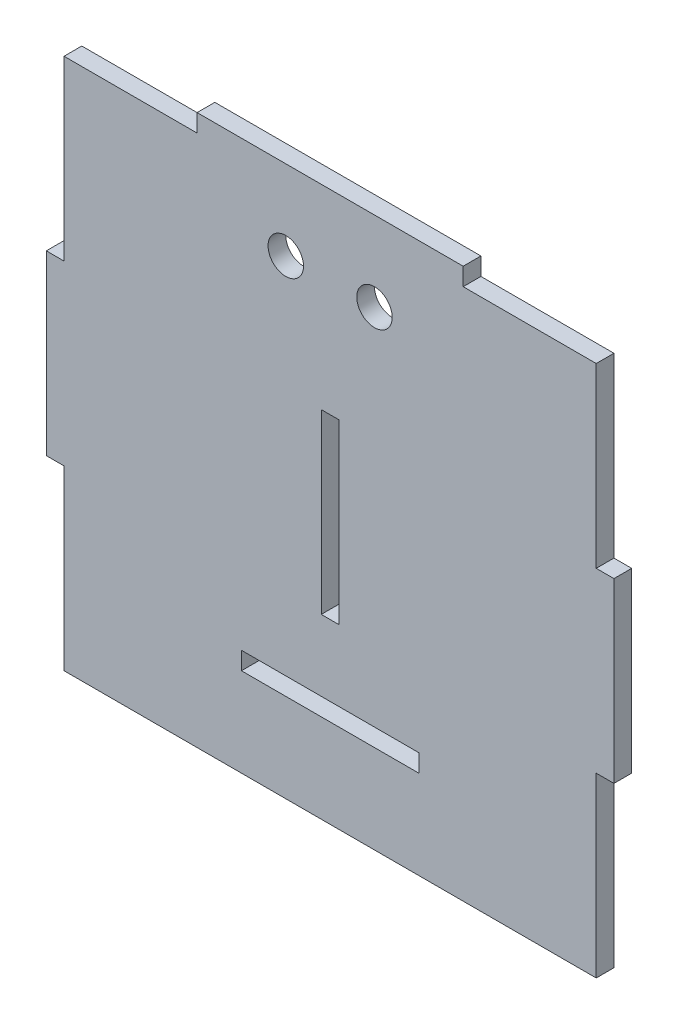
ISO-10303-21;
HEADER;
FILE_DESCRIPTION(('STEP AP214'),'2;1');
FILE_NAME('part.step','',(''),(''),'','','');
FILE_SCHEMA(('AUTOMOTIVE_DESIGN { 1 0 10303 214 1 1 1 1 }'));
ENDSEC;
DATA;
#1=APPLICATION_CONTEXT('core data for automotive mechanical design processes');
#2=APPLICATION_PROTOCOL_DEFINITION('international standard','automotive_design',2000,#1);
#3=PRODUCT_CONTEXT('',#1,'mechanical');
#4=PRODUCT('Part','Part','',(#3));
#5=PRODUCT_RELATED_PRODUCT_CATEGORY('part','',(#4));
#6=PRODUCT_DEFINITION_FORMATION('','',#4);
#7=PRODUCT_DEFINITION_CONTEXT('part definition',#1,'design');
#8=PRODUCT_DEFINITION('design','',#6,#7);
#9=PRODUCT_DEFINITION_SHAPE('','',#8);
#10=(LENGTH_UNIT() NAMED_UNIT(*) SI_UNIT(.MILLI.,.METRE.));
#11=(NAMED_UNIT(*) PLANE_ANGLE_UNIT() SI_UNIT($,.RADIAN.));
#12=(NAMED_UNIT(*) SI_UNIT($,.STERADIAN.) SOLID_ANGLE_UNIT());
#13=UNCERTAINTY_MEASURE_WITH_UNIT(LENGTH_MEASURE(1.E-05),#10,'distance_accuracy_value','');
#14=(GEOMETRIC_REPRESENTATION_CONTEXT(3) GLOBAL_UNCERTAINTY_ASSIGNED_CONTEXT((#13)) GLOBAL_UNIT_ASSIGNED_CONTEXT((#10,
#11,#12)) REPRESENTATION_CONTEXT('',''));
#15=CARTESIAN_POINT('',(0.,0.,0.));
#16=DIRECTION('',(0.,0.,1.));
#17=DIRECTION('',(1.,0.,0.));
#18=AXIS2_PLACEMENT_3D('',#15,#16,#17);
#19=CARTESIAN_POINT('',(0.,40.,2.));
#20=DIRECTION('',(0.,1.,0.));
#21=DIRECTION('',(0.,0.,1.));
#22=AXIS2_PLACEMENT_3D('',#19,#20,#21);
#23=PLANE('',#22);
#24=DIRECTION('',(1.,0.,0.));
#25=VECTOR('',#24,1.);
#26=CARTESIAN_POINT('',(0.,40.,0.));
#27=LINE('',#26,#25);
#28=CARTESIAN_POINT('',(29.,40.,0.));
#29=VERTEX_POINT('',#28);
#30=CARTESIAN_POINT('',(31.,40.,0.));
#31=VERTEX_POINT('',#30);
#32=EDGE_CURVE('E320',#29,#31,#27,.T.);
#33=ORIENTED_EDGE('',*,*,#32,.T.);
#34=DIRECTION('',(0.,0.,-1.));
#35=VECTOR('',#34,1.);
#36=CARTESIAN_POINT('',(31.,40.,2.));
#37=LINE('',#36,#35);
#38=CARTESIAN_POINT('',(31.,40.,2.));
#39=VERTEX_POINT('',#38);
#40=EDGE_CURVE('E11',#39,#31,#37,.T.);
#41=ORIENTED_EDGE('',*,*,#40,.F.);
#42=DIRECTION('',(1.,0.,0.));
#43=VECTOR('',#42,1.);
#44=CARTESIAN_POINT('',(0.,40.,2.));
#45=LINE('',#44,#43);
#46=CARTESIAN_POINT('',(29.,40.,2.));
#47=VERTEX_POINT('',#46);
#48=EDGE_CURVE('E222',#47,#39,#45,.T.);
#49=ORIENTED_EDGE('',*,*,#48,.F.);
#50=DIRECTION('',(0.,0.,-1.));
#51=VECTOR('',#50,1.);
#52=CARTESIAN_POINT('',(29.,40.,2.));
#53=LINE('',#52,#51);
#54=EDGE_CURVE('E65',#47,#29,#53,.T.);
#55=ORIENTED_EDGE('',*,*,#54,.T.);
#56=EDGE_LOOP('',(#33,#41,#49,#55));
#57=FACE_BOUND('',#56,.T.);
#58=ADVANCED_FACE('F45',(#57),#23,.F.);
#59=CARTESIAN_POINT('',(31.,0.,2.));
#60=DIRECTION('',(1.,0.,0.));
#61=DIRECTION('',(0.,0.,-1.));
#62=AXIS2_PLACEMENT_3D('',#59,#60,#61);
#63=PLANE('',#62);
#64=DIRECTION('',(0.,-1.,0.));
#65=VECTOR('',#64,1.);
#66=CARTESIAN_POINT('',(31.,0.,0.));
#67=LINE('',#66,#65);
#68=CARTESIAN_POINT('',(31.,20.,0.));
#69=VERTEX_POINT('',#68);
#70=EDGE_CURVE('E229',#31,#69,#67,.T.);
#71=ORIENTED_EDGE('',*,*,#70,.T.);
#72=DIRECTION('',(0.,0.,-1.));
#73=VECTOR('',#72,1.);
#74=CARTESIAN_POINT('',(31.,20.,2.));
#75=LINE('',#74,#73);
#76=CARTESIAN_POINT('',(31.,20.,2.));
#77=VERTEX_POINT('',#76);
#78=EDGE_CURVE('E56',#77,#69,#75,.T.);
#79=ORIENTED_EDGE('',*,*,#78,.F.);
#80=DIRECTION('',(0.,-1.,0.));
#81=VECTOR('',#80,1.);
#82=CARTESIAN_POINT('',(31.,0.,2.));
#83=LINE('',#82,#81);
#84=EDGE_CURVE('E216',#39,#77,#83,.T.);
#85=ORIENTED_EDGE('',*,*,#84,.F.);
#86=ORIENTED_EDGE('',*,*,#40,.T.);
#87=EDGE_LOOP('',(#71,#79,#85,#86));
#88=FACE_BOUND('',#87,.T.);
#89=ADVANCED_FACE('F228',(#88),#63,.F.);
#90=CARTESIAN_POINT('',(0.,20.,2.));
#91=DIRECTION('',(0.,1.,0.));
#92=DIRECTION('',(0.,0.,1.));
#93=AXIS2_PLACEMENT_3D('',#90,#91,#92);
#94=PLANE('',#93);
#95=DIRECTION('',(1.,0.,0.));
#96=VECTOR('',#95,1.);
#97=CARTESIAN_POINT('',(0.,20.,0.));
#98=LINE('',#97,#96);
#99=CARTESIAN_POINT('',(29.,20.,0.));
#100=VERTEX_POINT('',#99);
#101=EDGE_CURVE('E325',#100,#69,#98,.T.);
#102=ORIENTED_EDGE('',*,*,#101,.F.);
#103=DIRECTION('',(0.,0.,-1.));
#104=VECTOR('',#103,1.);
#105=CARTESIAN_POINT('',(29.,20.,2.));
#106=LINE('',#105,#104);
#107=CARTESIAN_POINT('',(29.,20.,2.));
#108=VERTEX_POINT('',#107);
#109=EDGE_CURVE('E139',#108,#100,#106,.T.);
#110=ORIENTED_EDGE('',*,*,#109,.F.);
#111=DIRECTION('',(1.,0.,0.));
#112=VECTOR('',#111,1.);
#113=CARTESIAN_POINT('',(0.,20.,2.));
#114=LINE('',#113,#112);
#115=EDGE_CURVE('E221',#108,#77,#114,.T.);
#116=ORIENTED_EDGE('',*,*,#115,.T.);
#117=ORIENTED_EDGE('',*,*,#78,.T.);
#118=EDGE_LOOP('',(#102,#110,#116,#117));
#119=FACE_BOUND('',#118,.T.);
#120=ADVANCED_FACE('F234',(#119),#94,.T.);
#121=CARTESIAN_POINT('',(0.,12.,2.));
#122=DIRECTION('',(0.,1.,0.));
#123=DIRECTION('',(0.,0.,1.));
#124=AXIS2_PLACEMENT_3D('',#121,#122,#123);
#125=PLANE('',#124);
#126=DIRECTION('',(1.,0.,0.));
#127=VECTOR('',#126,1.);
#128=CARTESIAN_POINT('',(0.,12.,0.));
#129=LINE('',#128,#127);
#130=CARTESIAN_POINT('',(20.,12.,0.));
#131=VERTEX_POINT('',#130);
#132=CARTESIAN_POINT('',(40.,12.,0.));
#133=VERTEX_POINT('',#132);
#134=EDGE_CURVE('E304',#131,#133,#129,.T.);
#135=ORIENTED_EDGE('',*,*,#134,.T.);
#136=DIRECTION('',(0.,0.,-1.));
#137=VECTOR('',#136,1.);
#138=CARTESIAN_POINT('',(40.,12.,2.));
#139=LINE('',#138,#137);
#140=CARTESIAN_POINT('',(40.,12.,2.));
#141=VERTEX_POINT('',#140);
#142=EDGE_CURVE('E335',#141,#133,#139,.T.);
#143=ORIENTED_EDGE('',*,*,#142,.F.);
#144=DIRECTION('',(1.,0.,0.));
#145=VECTOR('',#144,1.);
#146=CARTESIAN_POINT('',(0.,12.,2.));
#147=LINE('',#146,#145);
#148=CARTESIAN_POINT('',(20.,12.,2.));
#149=VERTEX_POINT('',#148);
#150=EDGE_CURVE('E526',#149,#141,#147,.T.);
#151=ORIENTED_EDGE('',*,*,#150,.F.);
#152=DIRECTION('',(0.,0.,-1.));
#153=VECTOR('',#152,1.);
#154=CARTESIAN_POINT('',(20.,12.,2.));
#155=LINE('',#154,#153);
#156=EDGE_CURVE('E338',#149,#131,#155,.T.);
#157=ORIENTED_EDGE('',*,*,#156,.T.);
#158=EDGE_LOOP('',(#135,#143,#151,#157));
#159=FACE_BOUND('',#158,.T.);
#160=ADVANCED_FACE('F561',(#159),#125,.F.);
#161=CARTESIAN_POINT('',(40.,0.,2.));
#162=DIRECTION('',(1.,0.,0.));
#163=DIRECTION('',(0.,0.,-1.));
#164=AXIS2_PLACEMENT_3D('',#161,#162,#163);
#165=PLANE('',#164);
#166=DIRECTION('',(0.,-1.,0.));
#167=VECTOR('',#166,1.);
#168=CARTESIAN_POINT('',(40.,0.,0.));
#169=LINE('',#168,#167);
#170=CARTESIAN_POINT('',(40.,9.99999999999997,0.));
#171=VERTEX_POINT('',#170);
#172=EDGE_CURVE('E308',#133,#171,#169,.T.);
#173=ORIENTED_EDGE('',*,*,#172,.T.);
#174=DIRECTION('',(0.,0.,-1.));
#175=VECTOR('',#174,1.);
#176=CARTESIAN_POINT('',(40.,9.99999999999997,2.));
#177=LINE('',#176,#175);
#178=CARTESIAN_POINT('',(40.,9.99999999999997,2.));
#179=VERTEX_POINT('',#178);
#180=EDGE_CURVE('E344',#179,#171,#177,.T.);
#181=ORIENTED_EDGE('',*,*,#180,.F.);
#182=DIRECTION('',(0.,-1.,0.));
#183=VECTOR('',#182,1.);
#184=CARTESIAN_POINT('',(40.,0.,2.));
#185=LINE('',#184,#183);
#186=EDGE_CURVE('E530',#141,#179,#185,.T.);
#187=ORIENTED_EDGE('',*,*,#186,.F.);
#188=ORIENTED_EDGE('',*,*,#142,.T.);
#189=EDGE_LOOP('',(#173,#181,#187,#188));
#190=FACE_BOUND('',#189,.T.);
#191=ADVANCED_FACE('F564',(#190),#165,.F.);
#192=CARTESIAN_POINT('',(0.,10.,2.));
#193=DIRECTION('',(0.,1.,0.));
#194=DIRECTION('',(-1.,0.,0.));
#195=AXIS2_PLACEMENT_3D('',#192,#193,#194);
#196=PLANE('',#195);
#197=DIRECTION('',(1.,0.,0.));
#198=VECTOR('',#197,1.);
#199=CARTESIAN_POINT('',(0.,10.,0.));
#200=LINE('',#199,#198);
#201=CARTESIAN_POINT('',(20.,10.,0.));
#202=VERTEX_POINT('',#201);
#203=EDGE_CURVE('E312',#202,#171,#200,.T.);
#204=ORIENTED_EDGE('',*,*,#203,.F.);
#205=DIRECTION('',(0.,0.,-1.));
#206=VECTOR('',#205,1.);
#207=CARTESIAN_POINT('',(20.,10.,2.));
#208=LINE('',#207,#206);
#209=CARTESIAN_POINT('',(20.,10.,2.));
#210=VERTEX_POINT('',#209);
#211=EDGE_CURVE('E341',#210,#202,#208,.T.);
#212=ORIENTED_EDGE('',*,*,#211,.F.);
#213=DIRECTION('',(1.,0.,0.));
#214=VECTOR('',#213,1.);
#215=CARTESIAN_POINT('',(0.,10.,2.));
#216=LINE('',#215,#214);
#217=EDGE_CURVE('E533',#210,#179,#216,.T.);
#218=ORIENTED_EDGE('',*,*,#217,.T.);
#219=ORIENTED_EDGE('',*,*,#180,.T.);
#220=EDGE_LOOP('',(#204,#212,#218,#219));
#221=FACE_BOUND('',#220,.T.);
#222=ADVANCED_FACE('F567',(#221),#196,.T.);
#223=CARTESIAN_POINT('',(-2.,0.,2.));
#224=DIRECTION('',(1.,0.,0.));
#225=DIRECTION('',(0.,0.,-1.));
#226=AXIS2_PLACEMENT_3D('',#223,#224,#225);
#227=PLANE('',#226);
#228=DIRECTION('',(0.,-1.,0.));
#229=VECTOR('',#228,1.);
#230=CARTESIAN_POINT('',(-2.,0.,0.));
#231=LINE('',#230,#229);
#232=CARTESIAN_POINT('',(-2.,40.,0.));
#233=VERTEX_POINT('',#232);
#234=CARTESIAN_POINT('',(-2.,20.,0.));
#235=VERTEX_POINT('',#234);
#236=EDGE_CURVE('E243',#233,#235,#231,.T.);
#237=ORIENTED_EDGE('',*,*,#236,.T.);
#238=DIRECTION('',(0.,0.,-1.));
#239=VECTOR('',#238,1.);
#240=CARTESIAN_POINT('',(-2.,20.,2.));
#241=LINE('',#240,#239);
#242=CARTESIAN_POINT('',(-2.,20.,2.));
#243=VERTEX_POINT('',#242);
#244=EDGE_CURVE('E49',#243,#235,#241,.T.);
#245=ORIENTED_EDGE('',*,*,#244,.F.);
#246=DIRECTION('',(0.,-1.,0.));
#247=VECTOR('',#246,1.);
#248=CARTESIAN_POINT('',(-2.,0.,2.));
#249=LINE('',#248,#247);
#250=CARTESIAN_POINT('',(-2.,40.,2.));
#251=VERTEX_POINT('',#250);
#252=EDGE_CURVE('E332',#251,#243,#249,.T.);
#253=ORIENTED_EDGE('',*,*,#252,.F.);
#254=DIRECTION('',(0.,0.,-1.));
#255=VECTOR('',#254,1.);
#256=CARTESIAN_POINT('',(-2.,40.,2.));
#257=LINE('',#256,#255);
#258=EDGE_CURVE('E239',#251,#233,#257,.T.);
#259=ORIENTED_EDGE('',*,*,#258,.T.);
#260=EDGE_LOOP('',(#237,#245,#253,#259));
#261=FACE_BOUND('',#260,.T.);
#262=ADVANCED_FACE('F47',(#261),#227,.F.);
#263=CARTESIAN_POINT('',(0.,20.,2.));
#264=DIRECTION('',(0.,1.,0.));
#265=DIRECTION('',(0.,0.,1.));
#266=AXIS2_PLACEMENT_3D('',#263,#264,#265);
#267=PLANE('',#266);
#268=DIRECTION('',(1.,0.,0.));
#269=VECTOR('',#268,1.);
#270=CARTESIAN_POINT('',(0.,20.,0.));
#271=LINE('',#270,#269);
#272=CARTESIAN_POINT('',(0.,20.,0.));
#273=VERTEX_POINT('',#272);
#274=EDGE_CURVE('E247',#235,#273,#271,.T.);
#275=ORIENTED_EDGE('',*,*,#274,.T.);
#276=DIRECTION('',(0.,0.,-1.));
#277=VECTOR('',#276,1.);
#278=CARTESIAN_POINT('',(0.,20.,2.));
#279=LINE('',#278,#277);
#280=CARTESIAN_POINT('',(0.,20.,2.));
#281=VERTEX_POINT('',#280);
#282=EDGE_CURVE('E391',#281,#273,#279,.T.);
#283=ORIENTED_EDGE('',*,*,#282,.F.);
#284=DIRECTION('',(1.,0.,0.));
#285=VECTOR('',#284,1.);
#286=CARTESIAN_POINT('',(0.,20.,2.));
#287=LINE('',#286,#285);
#288=EDGE_CURVE('E152',#243,#281,#287,.T.);
#289=ORIENTED_EDGE('',*,*,#288,.F.);
#290=ORIENTED_EDGE('',*,*,#244,.T.);
#291=EDGE_LOOP('',(#275,#283,#289,#290));
#292=FACE_BOUND('',#291,.T.);
#293=ADVANCED_FACE('F399',(#292),#267,.F.);
#294=CARTESIAN_POINT('',(0.,0.,2.));
#295=DIRECTION('',(1.,0.,0.));
#296=DIRECTION('',(0.,1.,0.));
#297=AXIS2_PLACEMENT_3D('',#294,#295,#296);
#298=PLANE('',#297);
#299=DIRECTION('',(0.,-1.,0.));
#300=VECTOR('',#299,1.);
#301=CARTESIAN_POINT('',(0.,0.,0.));
#302=LINE('',#301,#300);
#303=CARTESIAN_POINT('',(0.,0.,0.));
#304=VERTEX_POINT('',#303);
#305=EDGE_CURVE('E250',#273,#304,#302,.T.);
#306=ORIENTED_EDGE('',*,*,#305,.T.);
#307=DIRECTION('',(0.,0.,-1.));
#308=VECTOR('',#307,1.);
#309=CARTESIAN_POINT('',(0.,0.,2.));
#310=LINE('',#309,#308);
#311=CARTESIAN_POINT('',(0.,0.,2.));
#312=VERTEX_POINT('',#311);
#313=EDGE_CURVE('E388',#312,#304,#310,.T.);
#314=ORIENTED_EDGE('',*,*,#313,.F.);
#315=DIRECTION('',(0.,-1.,0.));
#316=VECTOR('',#315,1.);
#317=CARTESIAN_POINT('',(0.,0.,2.));
#318=LINE('',#317,#316);
#319=EDGE_CURVE('E488',#281,#312,#318,.T.);
#320=ORIENTED_EDGE('',*,*,#319,.F.);
#321=ORIENTED_EDGE('',*,*,#282,.T.);
#322=EDGE_LOOP('',(#306,#314,#320,#321));
#323=FACE_BOUND('',#322,.T.);
#324=ADVANCED_FACE('F487',(#323),#298,.F.);
#325=CARTESIAN_POINT('',(0.,0.,2.));
#326=DIRECTION('',(0.,1.,0.));
#327=DIRECTION('',(-1.,0.,0.));
#328=AXIS2_PLACEMENT_3D('',#325,#326,#327);
#329=PLANE('',#328);
#330=DIRECTION('',(1.,0.,0.));
#331=VECTOR('',#330,1.);
#332=CARTESIAN_POINT('',(0.,0.,0.));
#333=LINE('',#332,#331);
#334=CARTESIAN_POINT('',(60.,0.,0.));
#335=VERTEX_POINT('',#334);
#336=EDGE_CURVE('E253',#304,#335,#333,.T.);
#337=ORIENTED_EDGE('',*,*,#336,.T.);
#338=DIRECTION('',(0.,0.,-1.));
#339=VECTOR('',#338,1.);
#340=CARTESIAN_POINT('',(60.,0.,2.));
#341=LINE('',#340,#339);
#342=CARTESIAN_POINT('',(60.,0.,2.));
#343=VERTEX_POINT('',#342);
#344=EDGE_CURVE('E385',#343,#335,#341,.T.);
#345=ORIENTED_EDGE('',*,*,#344,.F.);
#346=DIRECTION('',(1.,0.,0.));
#347=VECTOR('',#346,1.);
#348=CARTESIAN_POINT('',(0.,0.,2.));
#349=LINE('',#348,#347);
#350=EDGE_CURVE('E489',#312,#343,#349,.T.);
#351=ORIENTED_EDGE('',*,*,#350,.F.);
#352=ORIENTED_EDGE('',*,*,#313,.T.);
#353=EDGE_LOOP('',(#337,#345,#351,#352));
#354=FACE_BOUND('',#353,.T.);
#355=ADVANCED_FACE('F485',(#354),#329,.F.);
#356=CARTESIAN_POINT('',(60.,0.,2.));
#357=DIRECTION('',(1.,0.,0.));
#358=DIRECTION('',(0.,0.,-1.));
#359=AXIS2_PLACEMENT_3D('',#356,#357,#358);
#360=PLANE('',#359);
#361=DIRECTION('',(0.,-1.,0.));
#362=VECTOR('',#361,1.);
#363=CARTESIAN_POINT('',(60.,0.,0.));
#364=LINE('',#363,#362);
#365=CARTESIAN_POINT('',(60.,20.,0.));
#366=VERTEX_POINT('',#365);
#367=EDGE_CURVE('E258',#366,#335,#364,.T.);
#368=ORIENTED_EDGE('',*,*,#367,.F.);
#369=DIRECTION('',(0.,0.,-1.));
#370=VECTOR('',#369,1.);
#371=CARTESIAN_POINT('',(60.,20.,2.));
#372=LINE('',#371,#370);
#373=CARTESIAN_POINT('',(60.,20.,2.));
#374=VERTEX_POINT('',#373);
#375=EDGE_CURVE('E382',#374,#366,#372,.T.);
#376=ORIENTED_EDGE('',*,*,#375,.F.);
#377=DIRECTION('',(0.,-1.,0.));
#378=VECTOR('',#377,1.);
#379=CARTESIAN_POINT('',(60.,0.,2.));
#380=LINE('',#379,#378);
#381=EDGE_CURVE('E482',#374,#343,#380,.T.);
#382=ORIENTED_EDGE('',*,*,#381,.T.);
#383=ORIENTED_EDGE('',*,*,#344,.T.);
#384=EDGE_LOOP('',(#368,#376,#382,#383));
#385=FACE_BOUND('',#384,.T.);
#386=ADVANCED_FACE('F478',(#385),#360,.T.);
#387=CARTESIAN_POINT('',(0.,20.,2.));
#388=DIRECTION('',(0.,1.,0.));
#389=DIRECTION('',(0.,0.,1.));
#390=AXIS2_PLACEMENT_3D('',#387,#388,#389);
#391=PLANE('',#390);
#392=DIRECTION('',(1.,0.,0.));
#393=VECTOR('',#392,1.);
#394=CARTESIAN_POINT('',(0.,20.,0.));
#395=LINE('',#394,#393);
#396=CARTESIAN_POINT('',(62.,20.,0.));
#397=VERTEX_POINT('',#396);
#398=EDGE_CURVE('E262',#366,#397,#395,.T.);
#399=ORIENTED_EDGE('',*,*,#398,.T.);
#400=DIRECTION('',(0.,0.,-1.));
#401=VECTOR('',#400,1.);
#402=CARTESIAN_POINT('',(62.,20.,2.));
#403=LINE('',#402,#401);
#404=CARTESIAN_POINT('',(62.,20.,2.));
#405=VERTEX_POINT('',#404);
#406=EDGE_CURVE('E379',#405,#397,#403,.T.);
#407=ORIENTED_EDGE('',*,*,#406,.F.);
#408=DIRECTION('',(1.,0.,0.));
#409=VECTOR('',#408,1.);
#410=CARTESIAN_POINT('',(0.,20.,2.));
#411=LINE('',#410,#409);
#412=EDGE_CURVE('E495',#374,#405,#411,.T.);
#413=ORIENTED_EDGE('',*,*,#412,.F.);
#414=ORIENTED_EDGE('',*,*,#375,.T.);
#415=EDGE_LOOP('',(#399,#407,#413,#414));
#416=FACE_BOUND('',#415,.T.);
#417=ADVANCED_FACE('F474',(#416),#391,.F.);
#418=CARTESIAN_POINT('',(62.,0.,2.));
#419=DIRECTION('',(1.,0.,0.));
#420=DIRECTION('',(0.,0.,-1.));
#421=AXIS2_PLACEMENT_3D('',#418,#419,#420);
#422=PLANE('',#421);
#423=DIRECTION('',(0.,-1.,0.));
#424=VECTOR('',#423,1.);
#425=CARTESIAN_POINT('',(62.,0.,0.));
#426=LINE('',#425,#424);
#427=CARTESIAN_POINT('',(62.,40.,0.));
#428=VERTEX_POINT('',#427);
#429=EDGE_CURVE('E267',#428,#397,#426,.T.);
#430=ORIENTED_EDGE('',*,*,#429,.F.);
#431=DIRECTION('',(0.,0.,-1.));
#432=VECTOR('',#431,1.);
#433=CARTESIAN_POINT('',(62.,40.,2.));
#434=LINE('',#433,#432);
#435=CARTESIAN_POINT('',(62.,40.,2.));
#436=VERTEX_POINT('',#435);
#437=EDGE_CURVE('E376',#436,#428,#434,.T.);
#438=ORIENTED_EDGE('',*,*,#437,.F.);
#439=DIRECTION('',(0.,-1.,0.));
#440=VECTOR('',#439,1.);
#441=CARTESIAN_POINT('',(62.,0.,2.));
#442=LINE('',#441,#440);
#443=EDGE_CURVE('E471',#436,#405,#442,.T.);
#444=ORIENTED_EDGE('',*,*,#443,.T.);
#445=ORIENTED_EDGE('',*,*,#406,.T.);
#446=EDGE_LOOP('',(#430,#438,#444,#445));
#447=FACE_BOUND('',#446,.T.);
#448=ADVANCED_FACE('F469',(#447),#422,.T.);
#449=CARTESIAN_POINT('',(0.,40.,2.));
#450=DIRECTION('',(0.,1.,0.));
#451=DIRECTION('',(0.,0.,1.));
#452=AXIS2_PLACEMENT_3D('',#449,#450,#451);
#453=PLANE('',#452);
#454=DIRECTION('',(1.,0.,0.));
#455=VECTOR('',#454,1.);
#456=CARTESIAN_POINT('',(0.,40.,0.));
#457=LINE('',#456,#455);
#458=CARTESIAN_POINT('',(60.,40.,0.));
#459=VERTEX_POINT('',#458);
#460=EDGE_CURVE('E271',#459,#428,#457,.T.);
#461=ORIENTED_EDGE('',*,*,#460,.F.);
#462=DIRECTION('',(0.,0.,-1.));
#463=VECTOR('',#462,1.);
#464=CARTESIAN_POINT('',(60.,40.,2.));
#465=LINE('',#464,#463);
#466=CARTESIAN_POINT('',(60.,40.,2.));
#467=VERTEX_POINT('',#466);
#468=EDGE_CURVE('E373',#467,#459,#465,.T.);
#469=ORIENTED_EDGE('',*,*,#468,.F.);
#470=DIRECTION('',(1.,0.,0.));
#471=VECTOR('',#470,1.);
#472=CARTESIAN_POINT('',(0.,40.,2.));
#473=LINE('',#472,#471);
#474=EDGE_CURVE('E465',#467,#436,#473,.T.);
#475=ORIENTED_EDGE('',*,*,#474,.T.);
#476=ORIENTED_EDGE('',*,*,#437,.T.);
#477=EDGE_LOOP('',(#461,#469,#475,#476));
#478=FACE_BOUND('',#477,.T.);
#479=ADVANCED_FACE('F462',(#478),#453,.T.);
#480=CARTESIAN_POINT('',(60.,59.9999999999987,0.));
#481=VERTEX_POINT('',#480);
#482=EDGE_CURVE('E263',#481,#459,#364,.T.);
#483=ORIENTED_EDGE('',*,*,#482,.F.);
#484=DIRECTION('',(0.,0.,-1.));
#485=VECTOR('',#484,1.);
#486=CARTESIAN_POINT('',(60.,59.9999999999987,2.));
#487=LINE('',#486,#485);
#488=CARTESIAN_POINT('',(60.,59.9999999999987,2.));
#489=VERTEX_POINT('',#488);
#490=EDGE_CURVE('E370',#489,#481,#487,.T.);
#491=ORIENTED_EDGE('',*,*,#490,.F.);
#492=EDGE_CURVE('E497',#489,#467,#380,.T.);
#493=ORIENTED_EDGE('',*,*,#492,.T.);
#494=ORIENTED_EDGE('',*,*,#468,.T.);
#495=EDGE_LOOP('',(#483,#491,#493,#494));
#496=FACE_BOUND('',#495,.T.);
#497=ADVANCED_FACE('F456',(#496),#360,.T.);
#498=CARTESIAN_POINT('',(0.,59.9999999999987,2.));
#499=DIRECTION('',(0.,1.,0.));
#500=DIRECTION('',(0.,0.,1.));
#501=AXIS2_PLACEMENT_3D('',#498,#499,#500);
#502=PLANE('',#501);
#503=DIRECTION('',(1.,0.,0.));
#504=VECTOR('',#503,1.);
#505=CARTESIAN_POINT('',(0.,59.9999999999987,0.));
#506=LINE('',#505,#504);
#507=CARTESIAN_POINT('',(45.,59.9999999999987,0.));
#508=VERTEX_POINT('',#507);
#509=EDGE_CURVE('E275',#508,#481,#506,.T.);
#510=ORIENTED_EDGE('',*,*,#509,.F.);
#511=DIRECTION('',(0.,0.,-1.));
#512=VECTOR('',#511,1.);
#513=CARTESIAN_POINT('',(45.,59.9999999999987,2.));
#514=LINE('',#513,#512);
#515=CARTESIAN_POINT('',(45.,59.9999999999987,2.));
#516=VERTEX_POINT('',#515);
#517=EDGE_CURVE('E367',#516,#508,#514,.T.);
#518=ORIENTED_EDGE('',*,*,#517,.F.);
#519=DIRECTION('',(1.,0.,0.));
#520=VECTOR('',#519,1.);
#521=CARTESIAN_POINT('',(0.,59.9999999999987,2.));
#522=LINE('',#521,#520);
#523=EDGE_CURVE('E452',#516,#489,#522,.T.);
#524=ORIENTED_EDGE('',*,*,#523,.T.);
#525=ORIENTED_EDGE('',*,*,#490,.T.);
#526=EDGE_LOOP('',(#510,#518,#524,#525));
#527=FACE_BOUND('',#526,.T.);
#528=ADVANCED_FACE('F450',(#527),#502,.T.);
#529=CARTESIAN_POINT('',(45.,0.,2.));
#530=DIRECTION('',(1.,0.,0.));
#531=DIRECTION('',(0.,0.,-1.));
#532=AXIS2_PLACEMENT_3D('',#529,#530,#531);
#533=PLANE('',#532);
#534=DIRECTION('',(0.,-1.,0.));
#535=VECTOR('',#534,1.);
#536=CARTESIAN_POINT('',(45.,0.,0.));
#537=LINE('',#536,#535);
#538=CARTESIAN_POINT('',(45.,62.,0.));
#539=VERTEX_POINT('',#538);
#540=EDGE_CURVE('E279',#539,#508,#537,.T.);
#541=ORIENTED_EDGE('',*,*,#540,.F.);
#542=DIRECTION('',(0.,0.,-1.));
#543=VECTOR('',#542,1.);
#544=CARTESIAN_POINT('',(45.,62.,2.));
#545=LINE('',#544,#543);
#546=CARTESIAN_POINT('',(45.,62.,2.));
#547=VERTEX_POINT('',#546);
#548=EDGE_CURVE('E364',#547,#539,#545,.T.);
#549=ORIENTED_EDGE('',*,*,#548,.F.);
#550=DIRECTION('',(0.,-1.,0.));
#551=VECTOR('',#550,1.);
#552=CARTESIAN_POINT('',(45.,0.,2.));
#553=LINE('',#552,#551);
#554=EDGE_CURVE('E446',#547,#516,#553,.T.);
#555=ORIENTED_EDGE('',*,*,#554,.T.);
#556=ORIENTED_EDGE('',*,*,#517,.T.);
#557=EDGE_LOOP('',(#541,#549,#555,#556));
#558=FACE_BOUND('',#557,.T.);
#559=ADVANCED_FACE('F443',(#558),#533,.T.);
#560=CARTESIAN_POINT('',(0.,62.,2.));
#561=DIRECTION('',(0.,1.,0.));
#562=DIRECTION('',(0.,0.,1.));
#563=AXIS2_PLACEMENT_3D('',#560,#561,#562);
#564=PLANE('',#563);
#565=DIRECTION('',(1.,0.,0.));
#566=VECTOR('',#565,1.);
#567=CARTESIAN_POINT('',(0.,62.,0.));
#568=LINE('',#567,#566);
#569=CARTESIAN_POINT('',(15.,62.,0.));
#570=VERTEX_POINT('',#569);
#571=EDGE_CURVE('E284',#570,#539,#568,.T.);
#572=ORIENTED_EDGE('',*,*,#571,.F.);
#573=DIRECTION('',(0.,0.,-1.));
#574=VECTOR('',#573,1.);
#575=CARTESIAN_POINT('',(15.,62.,2.));
#576=LINE('',#575,#574);
#577=CARTESIAN_POINT('',(15.,62.,2.));
#578=VERTEX_POINT('',#577);
#579=EDGE_CURVE('E361',#578,#570,#576,.T.);
#580=ORIENTED_EDGE('',*,*,#579,.F.);
#581=DIRECTION('',(1.,0.,0.));
#582=VECTOR('',#581,1.);
#583=CARTESIAN_POINT('',(0.,62.,2.));
#584=LINE('',#583,#582);
#585=EDGE_CURVE('E438',#578,#547,#584,.T.);
#586=ORIENTED_EDGE('',*,*,#585,.T.);
#587=ORIENTED_EDGE('',*,*,#548,.T.);
#588=EDGE_LOOP('',(#572,#580,#586,#587));
#589=FACE_BOUND('',#588,.T.);
#590=ADVANCED_FACE('F437',(#589),#564,.T.);
#591=CARTESIAN_POINT('',(15.,0.,2.));
#592=DIRECTION('',(1.,0.,0.));
#593=DIRECTION('',(0.,0.,-1.));
#594=AXIS2_PLACEMENT_3D('',#591,#592,#593);
#595=PLANE('',#594);
#596=DIRECTION('',(0.,-1.,0.));
#597=VECTOR('',#596,1.);
#598=CARTESIAN_POINT('',(15.,0.,0.));
#599=LINE('',#598,#597);
#600=CARTESIAN_POINT('',(15.,59.9999999999987,0.));
#601=VERTEX_POINT('',#600);
#602=EDGE_CURVE('E288',#570,#601,#599,.T.);
#603=ORIENTED_EDGE('',*,*,#602,.T.);
#604=DIRECTION('',(0.,0.,-1.));
#605=VECTOR('',#604,1.);
#606=CARTESIAN_POINT('',(15.,59.9999999999987,2.));
#607=LINE('',#606,#605);
#608=CARTESIAN_POINT('',(15.,59.9999999999987,2.));
#609=VERTEX_POINT('',#608);
#610=EDGE_CURVE('E358',#609,#601,#607,.T.);
#611=ORIENTED_EDGE('',*,*,#610,.F.);
#612=DIRECTION('',(0.,-1.,0.));
#613=VECTOR('',#612,1.);
#614=CARTESIAN_POINT('',(15.,0.,2.));
#615=LINE('',#614,#613);
#616=EDGE_CURVE('E433',#578,#609,#615,.T.);
#617=ORIENTED_EDGE('',*,*,#616,.F.);
#618=ORIENTED_EDGE('',*,*,#579,.T.);
#619=EDGE_LOOP('',(#603,#611,#617,#618));
#620=FACE_BOUND('',#619,.T.);
#621=ADVANCED_FACE('F432',(#620),#595,.F.);
#622=CARTESIAN_POINT('',(0.,59.9999999999987,0.));
#623=VERTEX_POINT('',#622);
#624=EDGE_CURVE('E280',#623,#601,#506,.T.);
#625=ORIENTED_EDGE('',*,*,#624,.F.);
#626=DIRECTION('',(0.,0.,-1.));
#627=VECTOR('',#626,1.);
#628=CARTESIAN_POINT('',(0.,59.9999999999987,2.));
#629=LINE('',#628,#627);
#630=CARTESIAN_POINT('',(0.,59.9999999999987,2.));
#631=VERTEX_POINT('',#630);
#632=EDGE_CURVE('E355',#631,#623,#629,.T.);
#633=ORIENTED_EDGE('',*,*,#632,.F.);
#634=EDGE_CURVE('E429',#631,#609,#522,.T.);
#635=ORIENTED_EDGE('',*,*,#634,.T.);
#636=ORIENTED_EDGE('',*,*,#610,.T.);
#637=EDGE_LOOP('',(#625,#633,#635,#636));
#638=FACE_BOUND('',#637,.T.);
#639=ADVANCED_FACE('F425',(#638),#502,.T.);
#640=CARTESIAN_POINT('',(0.,40.,0.));
#641=VERTEX_POINT('',#640);
#642=EDGE_CURVE('E254',#623,#641,#302,.T.);
#643=ORIENTED_EDGE('',*,*,#642,.T.);
#644=DIRECTION('',(0.,0.,-1.));
#645=VECTOR('',#644,1.);
#646=CARTESIAN_POINT('',(0.,40.,2.));
#647=LINE('',#646,#645);
#648=CARTESIAN_POINT('',(0.,40.,2.));
#649=VERTEX_POINT('',#648);
#650=EDGE_CURVE('E352',#649,#641,#647,.T.);
#651=ORIENTED_EDGE('',*,*,#650,.F.);
#652=EDGE_CURVE('E499',#631,#649,#318,.T.);
#653=ORIENTED_EDGE('',*,*,#652,.F.);
#654=ORIENTED_EDGE('',*,*,#632,.T.);
#655=EDGE_LOOP('',(#643,#651,#653,#654));
#656=FACE_BOUND('',#655,.T.);
#657=ADVANCED_FACE('F417',(#656),#298,.F.);
#658=CARTESIAN_POINT('',(20.,0.,2.));
#659=DIRECTION('',(1.,0.,0.));
#660=DIRECTION('',(0.,1.,0.));
#661=AXIS2_PLACEMENT_3D('',#658,#659,#660);
#662=PLANE('',#661);
#663=DIRECTION('',(0.,-1.,0.));
#664=VECTOR('',#663,1.);
#665=CARTESIAN_POINT('',(20.,0.,0.));
#666=LINE('',#665,#664);
#667=EDGE_CURVE('E316',#131,#202,#666,.T.);
#668=ORIENTED_EDGE('',*,*,#667,.F.);
#669=ORIENTED_EDGE('',*,*,#156,.F.);
#670=DIRECTION('',(0.,-1.,0.));
#671=VECTOR('',#670,1.);
#672=CARTESIAN_POINT('',(20.,0.,2.));
#673=LINE('',#672,#671);
#674=EDGE_CURVE('E537',#149,#210,#673,.T.);
#675=ORIENTED_EDGE('',*,*,#674,.T.);
#676=ORIENTED_EDGE('',*,*,#211,.T.);
#677=EDGE_LOOP('',(#668,#669,#675,#676));
#678=FACE_BOUND('',#677,.T.);
#679=ADVANCED_FACE('F570',(#678),#662,.T.);
#680=CARTESIAN_POINT('',(25.,53.,2.));
#681=DIRECTION('',(0.,0.,-1.));
#682=DIRECTION('',(-1.,0.,0.));
#683=AXIS2_PLACEMENT_3D('',#680,#681,#682);
#684=CYLINDRICAL_SURFACE('',#683,2.);
#685=CARTESIAN_POINT('',(25.,53.,2.));
#686=DIRECTION('',(0.,0.,1.));
#687=DIRECTION('',(1.,0.,0.));
#688=AXIS2_PLACEMENT_3D('',#685,#686,#687);
#689=CIRCLE('',#688,2.);
#690=CARTESIAN_POINT('',(27.,53.,2.));
#691=VERTEX_POINT('',#690);
#692=EDGE_CURVE('E522',#691,#691,#689,.T.);
#693=ORIENTED_EDGE('',*,*,#692,.T.);
#694=EDGE_LOOP('',(#693));
#695=FACE_BOUND('',#694,.T.);
#696=CARTESIAN_POINT('',(25.,53.,0.));
#697=DIRECTION('',(0.,0.,1.));
#698=DIRECTION('',(1.,0.,0.));
#699=AXIS2_PLACEMENT_3D('',#696,#697,#698);
#700=CIRCLE('',#699,2.);
#701=CARTESIAN_POINT('',(27.,53.,0.));
#702=VERTEX_POINT('',#701);
#703=EDGE_CURVE('E300',#702,#702,#700,.T.);
#704=ORIENTED_EDGE('',*,*,#703,.F.);
#705=EDGE_LOOP('',(#704));
#706=FACE_BOUND('',#705,.T.);
#707=ADVANCED_FACE('F592',(#695,#706),#684,.F.);
#708=CARTESIAN_POINT('',(35.,53.,2.));
#709=DIRECTION('',(0.,0.,-1.));
#710=DIRECTION('',(-1.,0.,0.));
#711=AXIS2_PLACEMENT_3D('',#708,#709,#710);
#712=CYLINDRICAL_SURFACE('',#711,2.);
#713=CARTESIAN_POINT('',(35.,53.,2.));
#714=DIRECTION('',(0.,0.,1.));
#715=DIRECTION('',(1.,0.,0.));
#716=AXIS2_PLACEMENT_3D('',#713,#714,#715);
#717=CIRCLE('',#716,2.);
#718=CARTESIAN_POINT('',(37.,53.,2.));
#719=VERTEX_POINT('',#718);
#720=EDGE_CURVE('E518',#719,#719,#717,.T.);
#721=ORIENTED_EDGE('',*,*,#720,.T.);
#722=EDGE_LOOP('',(#721));
#723=FACE_BOUND('',#722,.T.);
#724=CARTESIAN_POINT('',(35.,53.,0.));
#725=DIRECTION('',(0.,0.,1.));
#726=DIRECTION('',(1.,0.,0.));
#727=AXIS2_PLACEMENT_3D('',#724,#725,#726);
#728=CIRCLE('',#727,2.);
#729=CARTESIAN_POINT('',(37.,53.,0.));
#730=VERTEX_POINT('',#729);
#731=EDGE_CURVE('E296',#730,#730,#728,.T.);
#732=ORIENTED_EDGE('',*,*,#731,.F.);
#733=EDGE_LOOP('',(#732));
#734=FACE_BOUND('',#733,.T.);
#735=ADVANCED_FACE('F580',(#723,#734),#712,.F.);
#736=CARTESIAN_POINT('',(0.,40.,2.));
#737=DIRECTION('',(0.,1.,0.));
#738=DIRECTION('',(0.,0.,1.));
#739=AXIS2_PLACEMENT_3D('',#736,#737,#738);
#740=PLANE('',#739);
#741=DIRECTION('',(1.,0.,0.));
#742=VECTOR('',#741,1.);
#743=CARTESIAN_POINT('',(0.,40.,0.));
#744=LINE('',#743,#742);
#745=EDGE_CURVE('E292',#233,#641,#744,.T.);
#746=ORIENTED_EDGE('',*,*,#745,.F.);
#747=ORIENTED_EDGE('',*,*,#258,.F.);
#748=DIRECTION('',(1.,0.,0.));
#749=VECTOR('',#748,1.);
#750=CARTESIAN_POINT('',(0.,40.,2.));
#751=LINE('',#750,#749);
#752=EDGE_CURVE('E414',#251,#649,#751,.T.);
#753=ORIENTED_EDGE('',*,*,#752,.T.);
#754=ORIENTED_EDGE('',*,*,#650,.T.);
#755=EDGE_LOOP('',(#746,#747,#753,#754));
#756=FACE_BOUND('',#755,.T.);
#757=ADVANCED_FACE('F409',(#756),#740,.T.);
#758=CARTESIAN_POINT('',(29.,0.,2.));
#759=DIRECTION('',(1.,0.,0.));
#760=DIRECTION('',(0.,1.,0.));
#761=AXIS2_PLACEMENT_3D('',#758,#759,#760);
#762=PLANE('',#761);
#763=DIRECTION('',(0.,-1.,0.));
#764=VECTOR('',#763,1.);
#765=CARTESIAN_POINT('',(29.,0.,0.));
#766=LINE('',#765,#764);
#767=EDGE_CURVE('E328',#29,#100,#766,.T.);
#768=ORIENTED_EDGE('',*,*,#767,.F.);
#769=ORIENTED_EDGE('',*,*,#54,.F.);
#770=DIRECTION('',(0.,-1.,0.));
#771=VECTOR('',#770,1.);
#772=CARTESIAN_POINT('',(29.,0.,2.));
#773=LINE('',#772,#771);
#774=EDGE_CURVE('E236',#47,#108,#773,.T.);
#775=ORIENTED_EDGE('',*,*,#774,.T.);
#776=ORIENTED_EDGE('',*,*,#109,.T.);
#777=EDGE_LOOP('',(#768,#769,#775,#776));
#778=FACE_BOUND('',#777,.T.);
#779=ADVANCED_FACE('F549',(#778),#762,.T.);
#780=CARTESIAN_POINT('',(0.,0.,2.));
#781=DIRECTION('',(0.,0.,1.));
#782=DIRECTION('',(1.,0.,0.));
#783=AXIS2_PLACEMENT_3D('',#780,#781,#782);
#784=PLANE('',#783);
#785=ORIENTED_EDGE('',*,*,#252,.T.);
#786=ORIENTED_EDGE('',*,*,#288,.T.);
#787=ORIENTED_EDGE('',*,*,#319,.T.);
#788=ORIENTED_EDGE('',*,*,#350,.T.);
#789=ORIENTED_EDGE('',*,*,#381,.F.);
#790=ORIENTED_EDGE('',*,*,#412,.T.);
#791=ORIENTED_EDGE('',*,*,#443,.F.);
#792=ORIENTED_EDGE('',*,*,#474,.F.);
#793=ORIENTED_EDGE('',*,*,#492,.F.);
#794=ORIENTED_EDGE('',*,*,#523,.F.);
#795=ORIENTED_EDGE('',*,*,#554,.F.);
#796=ORIENTED_EDGE('',*,*,#585,.F.);
#797=ORIENTED_EDGE('',*,*,#616,.T.);
#798=ORIENTED_EDGE('',*,*,#634,.F.);
#799=ORIENTED_EDGE('',*,*,#652,.T.);
#800=ORIENTED_EDGE('',*,*,#752,.F.);
#801=EDGE_LOOP('',(#785,#786,#787,#788,#789,#790,#791,#792,#793,#794,#795,#796,#797,#798,#799,#800));
#802=FACE_BOUND('',#801,.T.);
#803=ORIENTED_EDGE('',*,*,#720,.F.);
#804=EDGE_LOOP('',(#803));
#805=FACE_BOUND('',#804,.T.);
#806=ORIENTED_EDGE('',*,*,#692,.F.);
#807=EDGE_LOOP('',(#806));
#808=FACE_BOUND('',#807,.T.);
#809=ORIENTED_EDGE('',*,*,#150,.T.);
#810=ORIENTED_EDGE('',*,*,#186,.T.);
#811=ORIENTED_EDGE('',*,*,#217,.F.);
#812=ORIENTED_EDGE('',*,*,#674,.F.);
#813=EDGE_LOOP('',(#809,#810,#811,#812));
#814=FACE_BOUND('',#813,.T.);
#815=ORIENTED_EDGE('',*,*,#48,.T.);
#816=ORIENTED_EDGE('',*,*,#84,.T.);
#817=ORIENTED_EDGE('',*,*,#115,.F.);
#818=ORIENTED_EDGE('',*,*,#774,.F.);
#819=EDGE_LOOP('',(#815,#816,#817,#818));
#820=FACE_BOUND('',#819,.T.);
#821=ADVANCED_FACE('F218',(#802,#805,#808,#814,#820),#784,.T.);
#822=CARTESIAN_POINT('',(0.,0.,0.));
#823=DIRECTION('',(0.,0.,1.));
#824=DIRECTION('',(1.,0.,0.));
#825=AXIS2_PLACEMENT_3D('',#822,#823,#824);
#826=PLANE('',#825);
#827=ORIENTED_EDGE('',*,*,#236,.F.);
#828=ORIENTED_EDGE('',*,*,#745,.T.);
#829=ORIENTED_EDGE('',*,*,#642,.F.);
#830=ORIENTED_EDGE('',*,*,#624,.T.);
#831=ORIENTED_EDGE('',*,*,#602,.F.);
#832=ORIENTED_EDGE('',*,*,#571,.T.);
#833=ORIENTED_EDGE('',*,*,#540,.T.);
#834=ORIENTED_EDGE('',*,*,#509,.T.);
#835=ORIENTED_EDGE('',*,*,#482,.T.);
#836=ORIENTED_EDGE('',*,*,#460,.T.);
#837=ORIENTED_EDGE('',*,*,#429,.T.);
#838=ORIENTED_EDGE('',*,*,#398,.F.);
#839=ORIENTED_EDGE('',*,*,#367,.T.);
#840=ORIENTED_EDGE('',*,*,#336,.F.);
#841=ORIENTED_EDGE('',*,*,#305,.F.);
#842=ORIENTED_EDGE('',*,*,#274,.F.);
#843=EDGE_LOOP('',(#827,#828,#829,#830,#831,#832,#833,#834,#835,#836,#837,#838,#839,#840,#841,#842));
#844=FACE_BOUND('',#843,.T.);
#845=ORIENTED_EDGE('',*,*,#731,.T.);
#846=EDGE_LOOP('',(#845));
#847=FACE_BOUND('',#846,.T.);
#848=ORIENTED_EDGE('',*,*,#703,.T.);
#849=EDGE_LOOP('',(#848));
#850=FACE_BOUND('',#849,.T.);
#851=ORIENTED_EDGE('',*,*,#134,.F.);
#852=ORIENTED_EDGE('',*,*,#667,.T.);
#853=ORIENTED_EDGE('',*,*,#203,.T.);
#854=ORIENTED_EDGE('',*,*,#172,.F.);
#855=EDGE_LOOP('',(#851,#852,#853,#854));
#856=FACE_BOUND('',#855,.T.);
#857=ORIENTED_EDGE('',*,*,#32,.F.);
#858=ORIENTED_EDGE('',*,*,#767,.T.);
#859=ORIENTED_EDGE('',*,*,#101,.T.);
#860=ORIENTED_EDGE('',*,*,#70,.F.);
#861=EDGE_LOOP('',(#857,#858,#859,#860));
#862=FACE_BOUND('',#861,.T.);
#863=ADVANCED_FACE('F405',(#844,#847,#850,#856,#862),#826,.F.);
#864=CLOSED_SHELL('',(#58,#89,#120,#160,#191,#222,#262,#293,#324,#355,#386,#417,#448,#479,#497,
#528,#559,#590,#621,#639,#657,#679,#707,#735,#757,#779,#821,#863));
#865=MANIFOLD_SOLID_BREP('B2',#864);
#866=ADVANCED_BREP_SHAPE_REPRESENTATION('',(#18,#865),#14);
#867=SHAPE_DEFINITION_REPRESENTATION(#9,#866);
ENDSEC;
END-ISO-10303-21;
